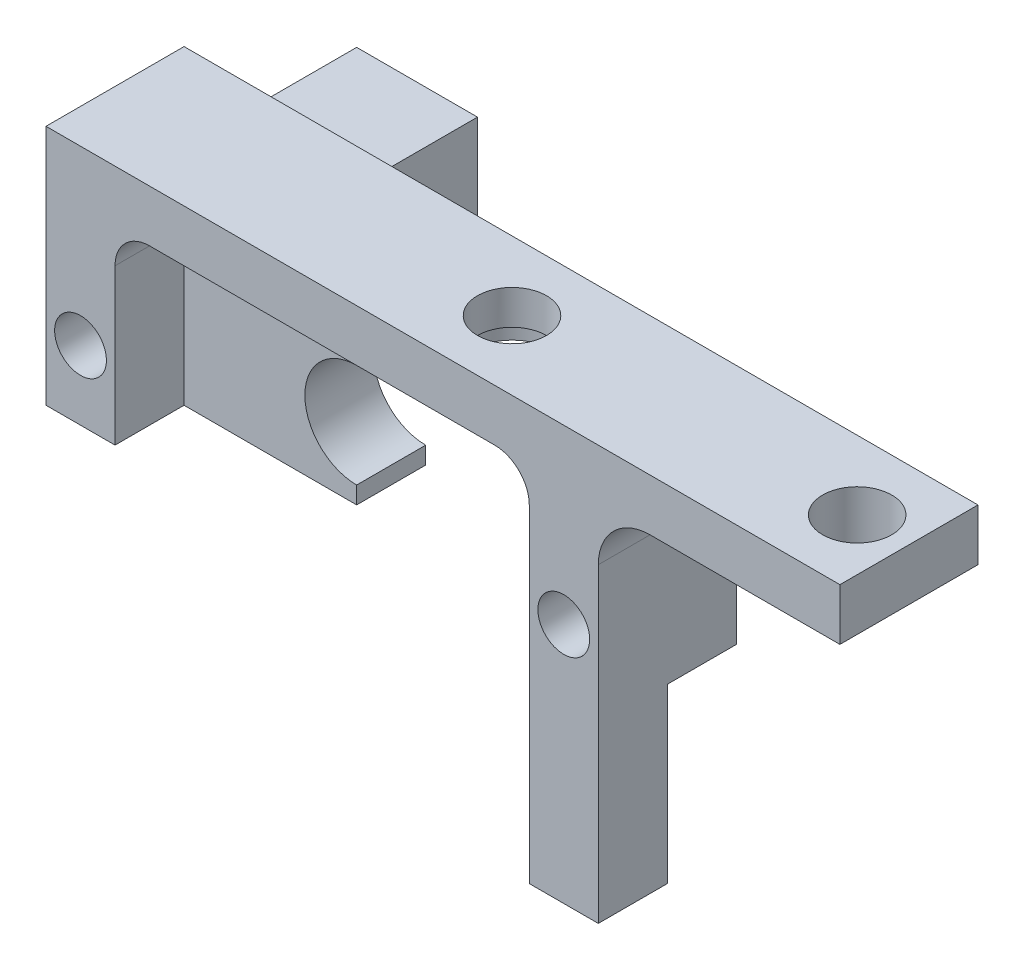
ISO-10303-21;
HEADER;
FILE_DESCRIPTION(('STEP AP214'),'2;1');
FILE_NAME('part.step','',(''),(''),'','','');
FILE_SCHEMA(('AUTOMOTIVE_DESIGN { 1 0 10303 214 1 1 1 1 }'));
ENDSEC;
DATA;
#1=APPLICATION_CONTEXT('core data for automotive mechanical design processes');
#2=APPLICATION_PROTOCOL_DEFINITION('international standard','automotive_design',2000,#1);
#3=PRODUCT_CONTEXT('',#1,'mechanical');
#4=PRODUCT('Part','Part','',(#3));
#5=PRODUCT_RELATED_PRODUCT_CATEGORY('part','',(#4));
#6=PRODUCT_DEFINITION_FORMATION('','',#4);
#7=PRODUCT_DEFINITION_CONTEXT('part definition',#1,'design');
#8=PRODUCT_DEFINITION('design','',#6,#7);
#9=PRODUCT_DEFINITION_SHAPE('','',#8);
#10=(LENGTH_UNIT() NAMED_UNIT(*) SI_UNIT(.MILLI.,.METRE.));
#11=(NAMED_UNIT(*) PLANE_ANGLE_UNIT() SI_UNIT($,.RADIAN.));
#12=(NAMED_UNIT(*) SI_UNIT($,.STERADIAN.) SOLID_ANGLE_UNIT());
#13=UNCERTAINTY_MEASURE_WITH_UNIT(LENGTH_MEASURE(1.E-05),#10,'distance_accuracy_value','');
#14=(GEOMETRIC_REPRESENTATION_CONTEXT(3) GLOBAL_UNCERTAINTY_ASSIGNED_CONTEXT((#13)) GLOBAL_UNIT_ASSIGNED_CONTEXT((#10,
#11,#12)) REPRESENTATION_CONTEXT('',''));
#15=CARTESIAN_POINT('',(0.,0.,0.));
#16=DIRECTION('',(0.,0.,1.));
#17=DIRECTION('',(1.,0.,0.));
#18=AXIS2_PLACEMENT_3D('',#15,#16,#17);
#19=CARTESIAN_POINT('',(7.,-3.,4.));
#20=DIRECTION('',(0.,1.,0.));
#21=DIRECTION('',(0.,0.,1.));
#22=AXIS2_PLACEMENT_3D('',#19,#20,#21);
#23=CYLINDRICAL_SURFACE('',#22,2.);
#24=CARTESIAN_POINT('',(7.,7.,4.));
#25=DIRECTION('',(0.,1.,0.));
#26=DIRECTION('',(0.,0.,1.));
#27=AXIS2_PLACEMENT_3D('',#24,#25,#26);
#28=CIRCLE('',#27,2.);
#29=CARTESIAN_POINT('',(7.,7.,6.));
#30=VERTEX_POINT('',#29);
#31=EDGE_CURVE('E268',#30,#30,#28,.T.);
#32=ORIENTED_EDGE('',*,*,#31,.T.);
#33=EDGE_LOOP('',(#32));
#34=FACE_BOUND('',#33,.T.);
#35=CARTESIAN_POINT('',(7.,5.,4.));
#36=DIRECTION('',(0.,-1.,0.));
#37=DIRECTION('',(0.,0.,-1.));
#38=AXIS2_PLACEMENT_3D('',#35,#36,#37);
#39=CIRCLE('',#38,2.);
#40=CARTESIAN_POINT('',(7.,5.,2.));
#41=VERTEX_POINT('',#40);
#42=EDGE_CURVE('E265',#41,#41,#39,.F.);
#43=ORIENTED_EDGE('',*,*,#42,.F.);
#44=EDGE_LOOP('',(#43));
#45=FACE_BOUND('',#44,.T.);
#46=ADVANCED_FACE('F39',(#34,#45),#23,.F.);
#47=CARTESIAN_POINT('',(0.,-7.,8.));
#48=DIRECTION('',(0.,1.,0.));
#49=DIRECTION('',(0.,0.,1.));
#50=AXIS2_PLACEMENT_3D('',#47,#48,#49);
#51=PLANE('',#50);
#52=DIRECTION('',(1.,0.,0.));
#53=VECTOR('',#52,1.);
#54=CARTESIAN_POINT('',(16.,-7.,4.));
#55=LINE('',#54,#53);
#56=CARTESIAN_POINT('',(12.,-7.,4.));
#57=VERTEX_POINT('',#56);
#58=CARTESIAN_POINT('',(16.,-7.,4.));
#59=VERTEX_POINT('',#58);
#60=EDGE_CURVE('E271',#57,#59,#55,.T.);
#61=ORIENTED_EDGE('',*,*,#60,.F.);
#62=DIRECTION('',(0.,0.,-1.));
#63=VECTOR('',#62,1.);
#64=CARTESIAN_POINT('',(12.,-7.,8.));
#65=LINE('',#64,#63);
#66=CARTESIAN_POINT('',(12.,-7.,0.));
#67=VERTEX_POINT('',#66);
#68=EDGE_CURVE('E342',#57,#67,#65,.T.);
#69=ORIENTED_EDGE('',*,*,#68,.T.);
#70=DIRECTION('',(1.,0.,0.));
#71=VECTOR('',#70,1.);
#72=CARTESIAN_POINT('',(0.,-7.,0.));
#73=LINE('',#72,#71);
#74=CARTESIAN_POINT('',(16.,-7.,0.));
#75=VERTEX_POINT('',#74);
#76=EDGE_CURVE('E411',#67,#75,#73,.T.);
#77=ORIENTED_EDGE('',*,*,#76,.T.);
#78=DIRECTION('',(0.,0.,-1.));
#79=VECTOR('',#78,1.);
#80=CARTESIAN_POINT('',(16.,-7.,8.));
#81=LINE('',#80,#79);
#82=EDGE_CURVE('E430',#59,#75,#81,.T.);
#83=ORIENTED_EDGE('',*,*,#82,.F.);
#84=EDGE_LOOP('',(#61,#69,#77,#83));
#85=FACE_BOUND('',#84,.T.);
#86=ADVANCED_FACE('F484',(#85),#51,.F.);
#87=DIRECTION('',(0.,0.,-1.));
#88=VECTOR('',#87,1.);
#89=CARTESIAN_POINT('',(-11.7533055844827,-7.,0.));
#90=LINE('',#89,#88);
#91=CARTESIAN_POINT('',(-11.7533055844827,-7.,0.));
#92=VERTEX_POINT('',#91);
#93=CARTESIAN_POINT('',(-11.7533055844827,-7.,-7.));
#94=VERTEX_POINT('',#93);
#95=EDGE_CURVE('E324',#92,#94,#90,.T.);
#96=ORIENTED_EDGE('',*,*,#95,.F.);
#97=CARTESIAN_POINT('',(-2.,-7.,0.));
#98=VERTEX_POINT('',#97);
#99=EDGE_CURVE('E415',#92,#98,#73,.T.);
#100=ORIENTED_EDGE('',*,*,#99,.T.);
#101=DIRECTION('',(0.,0.,-1.));
#102=VECTOR('',#101,1.);
#103=CARTESIAN_POINT('',(-2.,-7.,4.));
#104=LINE('',#103,#102);
#105=CARTESIAN_POINT('',(-2.,-7.,4.));
#106=VERTEX_POINT('',#105);
#107=EDGE_CURVE('E382',#106,#98,#104,.T.);
#108=ORIENTED_EDGE('',*,*,#107,.F.);
#109=DIRECTION('',(1.,0.,0.));
#110=VECTOR('',#109,1.);
#111=CARTESIAN_POINT('',(0.,-7.,4.));
#112=LINE('',#111,#110);
#113=CARTESIAN_POINT('',(-12.,-7.,4.));
#114=VERTEX_POINT('',#113);
#115=EDGE_CURVE('E353',#114,#106,#112,.T.);
#116=ORIENTED_EDGE('',*,*,#115,.F.);
#117=DIRECTION('',(0.,0.,-1.));
#118=VECTOR('',#117,1.);
#119=CARTESIAN_POINT('',(-12.,-7.,8.));
#120=LINE('',#119,#118);
#121=CARTESIAN_POINT('',(-12.,-7.,8.));
#122=VERTEX_POINT('',#121);
#123=EDGE_CURVE('E409',#122,#114,#120,.T.);
#124=ORIENTED_EDGE('',*,*,#123,.F.);
#125=DIRECTION('',(1.,0.,0.));
#126=VECTOR('',#125,1.);
#127=CARTESIAN_POINT('',(0.,-7.,8.));
#128=LINE('',#127,#126);
#129=CARTESIAN_POINT('',(-16.,-7.,8.));
#130=VERTEX_POINT('',#129);
#131=EDGE_CURVE('E391',#130,#122,#128,.T.);
#132=ORIENTED_EDGE('',*,*,#131,.F.);
#133=DIRECTION('',(0.,0.,-1.));
#134=VECTOR('',#133,1.);
#135=CARTESIAN_POINT('',(-16.,-7.,8.));
#136=LINE('',#135,#134);
#137=CARTESIAN_POINT('',(-16.,-7.,-10.));
#138=VERTEX_POINT('',#137);
#139=EDGE_CURVE('E425',#130,#138,#136,.T.);
#140=ORIENTED_EDGE('',*,*,#139,.T.);
#141=DIRECTION('',(-1.,0.,0.));
#142=VECTOR('',#141,1.);
#143=CARTESIAN_POINT('',(-16.,-7.,-10.));
#144=LINE('',#143,#142);
#145=CARTESIAN_POINT('',(-9.,-7.,-10.));
#146=VERTEX_POINT('',#145);
#147=EDGE_CURVE('E334',#146,#138,#144,.T.);
#148=ORIENTED_EDGE('',*,*,#147,.F.);
#149=DIRECTION('',(0.,0.,1.));
#150=VECTOR('',#149,1.);
#151=CARTESIAN_POINT('',(-9.,-7.,-10.));
#152=LINE('',#151,#150);
#153=CARTESIAN_POINT('',(-9.,-7.,-7.));
#154=VERTEX_POINT('',#153);
#155=EDGE_CURVE('E337',#146,#154,#152,.T.);
#156=ORIENTED_EDGE('',*,*,#155,.T.);
#157=DIRECTION('',(-1.,0.,0.));
#158=VECTOR('',#157,1.);
#159=CARTESIAN_POINT('',(0.,-7.,-7.));
#160=LINE('',#159,#158);
#161=EDGE_CURVE('E316',#154,#94,#160,.T.);
#162=ORIENTED_EDGE('',*,*,#161,.T.);
#163=EDGE_LOOP('',(#96,#100,#108,#116,#124,#132,#140,#148,#156,#162));
#164=FACE_BOUND('',#163,.T.);
#165=ADVANCED_FACE('F510',(#164),#51,.F.);
#166=CARTESIAN_POINT('',(-9.,7.,-10.));
#167=DIRECTION('',(-1.,0.,0.));
#168=DIRECTION('',(0.,-1.,0.));
#169=AXIS2_PLACEMENT_3D('',#166,#167,#168);
#170=PLANE('',#169);
#171=DIRECTION('',(0.,-1.,0.));
#172=VECTOR('',#171,1.);
#173=CARTESIAN_POINT('',(-9.,7.,-10.));
#174=LINE('',#173,#172);
#175=CARTESIAN_POINT('',(-9.,1.96034945359827,-10.));
#176=VERTEX_POINT('',#175);
#177=EDGE_CURVE('E332',#176,#146,#174,.T.);
#178=ORIENTED_EDGE('',*,*,#177,.F.);
#179=DIRECTION('',(0.,0.,-1.));
#180=VECTOR('',#179,1.);
#181=CARTESIAN_POINT('',(-9.,1.96034945359827,8.62543202569281));
#182=LINE('',#181,#180);
#183=CARTESIAN_POINT('',(-9.,1.96034945359827,0.));
#184=VERTEX_POINT('',#183);
#185=EDGE_CURVE('E297',#184,#176,#182,.T.);
#186=ORIENTED_EDGE('',*,*,#185,.F.);
#187=DIRECTION('',(0.,-1.,0.));
#188=VECTOR('',#187,1.);
#189=CARTESIAN_POINT('',(-9.,7.,0.));
#190=LINE('',#189,#188);
#191=CARTESIAN_POINT('',(-9.,-1.20437868815745,0.));
#192=VERTEX_POINT('',#191);
#193=EDGE_CURVE('E338',#184,#192,#190,.T.);
#194=ORIENTED_EDGE('',*,*,#193,.T.);
#195=DIRECTION('',(0.,0.,-1.));
#196=VECTOR('',#195,1.);
#197=CARTESIAN_POINT('',(-9.,-1.20437868815745,0.));
#198=LINE('',#197,#196);
#199=CARTESIAN_POINT('',(-9.,-1.20437868815745,-7.));
#200=VERTEX_POINT('',#199);
#201=EDGE_CURVE('E326',#192,#200,#198,.T.);
#202=ORIENTED_EDGE('',*,*,#201,.T.);
#203=DIRECTION('',(0.,-1.,0.));
#204=VECTOR('',#203,1.);
#205=CARTESIAN_POINT('',(-9.,7.,-7.));
#206=LINE('',#205,#204);
#207=EDGE_CURVE('E341',#200,#154,#206,.T.);
#208=ORIENTED_EDGE('',*,*,#207,.T.);
#209=ORIENTED_EDGE('',*,*,#155,.F.);
#210=EDGE_LOOP('',(#178,#186,#194,#202,#208,#209));
#211=FACE_BOUND('',#210,.T.);
#212=ADVANCED_FACE('F547',(#211),#170,.F.);
#213=CARTESIAN_POINT('',(0.,0.,0.));
#214=DIRECTION('',(0.,0.,1.));
#215=DIRECTION('',(1.,0.,0.));
#216=AXIS2_PLACEMENT_3D('',#213,#214,#215);
#217=PLANE('',#216);
#218=CARTESIAN_POINT('',(14.,-3.,0.));
#219=DIRECTION('',(0.,0.,1.));
#220=DIRECTION('',(1.,0.,0.));
#221=AXIS2_PLACEMENT_3D('',#218,#219,#220);
#222=CIRCLE('',#221,1.5);
#223=CARTESIAN_POINT('',(15.5,-3.,0.));
#224=VERTEX_POINT('',#223);
#225=EDGE_CURVE('E390',#224,#224,#222,.F.);
#226=ORIENTED_EDGE('',*,*,#225,.F.);
#227=EDGE_LOOP('',(#226));
#228=FACE_BOUND('',#227,.T.);
#229=DIRECTION('',(0.,1.,0.));
#230=VECTOR('',#229,1.);
#231=CARTESIAN_POINT('',(-12.,0.,0.));
#232=LINE('',#231,#230);
#233=CARTESIAN_POINT('',(-12.,2.,0.));
#234=VERTEX_POINT('',#233);
#235=CARTESIAN_POINT('',(-12.,4.96034945359827,0.));
#236=VERTEX_POINT('',#235);
#237=EDGE_CURVE('E434',#234,#236,#232,.T.);
#238=ORIENTED_EDGE('',*,*,#237,.T.);
#239=DIRECTION('',(-1.,0.,0.));
#240=VECTOR('',#239,1.);
#241=CARTESIAN_POINT('',(0.,4.96034945359827,0.));
#242=LINE('',#241,#240);
#243=CARTESIAN_POINT('',(-16.,4.96034945359827,0.));
#244=VERTEX_POINT('',#243);
#245=EDGE_CURVE('E437',#236,#244,#242,.T.);
#246=ORIENTED_EDGE('',*,*,#245,.T.);
#247=DIRECTION('',(0.,1.,0.));
#248=VECTOR('',#247,1.);
#249=CARTESIAN_POINT('',(-16.,7.,0.));
#250=LINE('',#249,#248);
#251=CARTESIAN_POINT('',(-16.,7.,0.));
#252=VERTEX_POINT('',#251);
#253=EDGE_CURVE('E295',#244,#252,#250,.T.);
#254=ORIENTED_EDGE('',*,*,#253,.T.);
#255=DIRECTION('',(1.,0.,0.));
#256=VECTOR('',#255,1.);
#257=CARTESIAN_POINT('',(0.,7.,0.));
#258=LINE('',#257,#256);
#259=CARTESIAN_POINT('',(30.,7.,0.));
#260=VERTEX_POINT('',#259);
#261=EDGE_CURVE('E418',#252,#260,#258,.T.);
#262=ORIENTED_EDGE('',*,*,#261,.T.);
#263=DIRECTION('',(0.,1.,0.));
#264=VECTOR('',#263,1.);
#265=CARTESIAN_POINT('',(30.,7.,0.));
#266=LINE('',#265,#264);
#267=CARTESIAN_POINT('',(30.,4.,0.));
#268=VERTEX_POINT('',#267);
#269=EDGE_CURVE('E248',#268,#260,#266,.T.);
#270=ORIENTED_EDGE('',*,*,#269,.F.);
#271=DIRECTION('',(-1.,0.,0.));
#272=VECTOR('',#271,1.);
#273=CARTESIAN_POINT('',(23.,4.,0.));
#274=LINE('',#273,#272);
#275=CARTESIAN_POINT('',(19.,4.,0.));
#276=VERTEX_POINT('',#275);
#277=EDGE_CURVE('E239',#268,#276,#274,.T.);
#278=ORIENTED_EDGE('',*,*,#277,.T.);
#279=CARTESIAN_POINT('',(19.,1.,0.));
#280=DIRECTION('',(0.,0.,1.));
#281=DIRECTION('',(1.,0.,0.));
#282=AXIS2_PLACEMENT_3D('',#279,#280,#281);
#283=CIRCLE('',#282,3.);
#284=CARTESIAN_POINT('',(16.,1.,0.));
#285=VERTEX_POINT('',#284);
#286=EDGE_CURVE('E451',#276,#285,#283,.T.);
#287=ORIENTED_EDGE('',*,*,#286,.T.);
#288=DIRECTION('',(0.,-1.,0.));
#289=VECTOR('',#288,1.);
#290=CARTESIAN_POINT('',(16.,0.,0.));
#291=LINE('',#290,#289);
#292=EDGE_CURVE('E414',#285,#75,#291,.T.);
#293=ORIENTED_EDGE('',*,*,#292,.T.);
#294=ORIENTED_EDGE('',*,*,#76,.F.);
#295=DIRECTION('',(0.,1.,0.));
#296=VECTOR('',#295,1.);
#297=CARTESIAN_POINT('',(12.,0.,0.));
#298=LINE('',#297,#296);
#299=CARTESIAN_POINT('',(12.,2.,0.));
#300=VERTEX_POINT('',#299);
#301=EDGE_CURVE('E376',#67,#300,#298,.T.);
#302=ORIENTED_EDGE('',*,*,#301,.T.);
#303=CARTESIAN_POINT('',(10.,2.,0.));
#304=DIRECTION('',(0.,0.,1.));
#305=DIRECTION('',(1.,0.,0.));
#306=AXIS2_PLACEMENT_3D('',#303,#304,#305);
#307=CIRCLE('',#306,2.);
#308=CARTESIAN_POINT('',(10.,4.,0.));
#309=VERTEX_POINT('',#308);
#310=EDGE_CURVE('E48',#300,#309,#307,.T.);
#311=ORIENTED_EDGE('',*,*,#310,.T.);
#312=DIRECTION('',(1.,0.,0.));
#313=VECTOR('',#312,1.);
#314=CARTESIAN_POINT('',(0.,4.,0.));
#315=LINE('',#314,#313);
#316=CARTESIAN_POINT('',(-10.,4.,0.));
#317=VERTEX_POINT('',#316);
#318=EDGE_CURVE('E420',#317,#309,#315,.T.);
#319=ORIENTED_EDGE('',*,*,#318,.F.);
#320=CARTESIAN_POINT('',(-10.,2.,0.));
#321=DIRECTION('',(0.,0.,1.));
#322=DIRECTION('',(1.,0.,0.));
#323=AXIS2_PLACEMENT_3D('',#320,#321,#322);
#324=CIRCLE('',#323,2.);
#325=EDGE_CURVE('E459',#317,#234,#324,.T.);
#326=ORIENTED_EDGE('',*,*,#325,.T.);
#327=EDGE_LOOP('',(#238,#246,#254,#262,#270,#278,#287,#293,#294,#302,#311,#319,#326));
#328=FACE_BOUND('',#327,.T.);
#329=ADVANCED_FACE('F479',(#228,#328),#217,.F.);
#330=ORIENTED_EDGE('',*,*,#99,.F.);
#331=CARTESIAN_POINT('',(5.54011802103854,-3.,0.));
#332=DIRECTION('',(0.,0.,-1.));
#333=DIRECTION('',(-1.,0.,0.));
#334=AXIS2_PLACEMENT_3D('',#331,#332,#333);
#335=CIRCLE('',#334,17.75);
#336=CARTESIAN_POINT('',(-12.2098819789615,-3.,0.));
#337=VERTEX_POINT('',#336);
#338=EDGE_CURVE('E307',#92,#337,#335,.T.);
#339=ORIENTED_EDGE('',*,*,#338,.T.);
#340=CARTESIAN_POINT('',(-10.4598819789615,-3.,0.));
#341=DIRECTION('',(0.,0.,-1.));
#342=DIRECTION('',(-1.,0.,0.));
#343=AXIS2_PLACEMENT_3D('',#340,#341,#342);
#344=CIRCLE('',#343,1.75);
#345=CARTESIAN_POINT('',(-10.4598819789615,-1.25,0.));
#346=VERTEX_POINT('',#345);
#347=EDGE_CURVE('E301',#337,#346,#344,.T.);
#348=ORIENTED_EDGE('',*,*,#347,.T.);
#349=DIRECTION('',(-0.999512076087079,-0.0312347523777212,0.));
#350=VECTOR('',#349,1.);
#351=CARTESIAN_POINT('',(0.0288196273375986,-0.922228074803155,0.));
#352=LINE('',#351,#350);
#353=EDGE_CURVE('E304',#192,#346,#352,.T.);
#354=ORIENTED_EDGE('',*,*,#353,.F.);
#355=ORIENTED_EDGE('',*,*,#193,.F.);
#356=DIRECTION('',(1.,0.,0.));
#357=VECTOR('',#356,1.);
#358=CARTESIAN_POINT('',(0.,1.96034945359827,0.));
#359=LINE('',#358,#357);
#360=CARTESIAN_POINT('',(-2.,1.96034945359827,0.));
#361=VERTEX_POINT('',#360);
#362=EDGE_CURVE('E369',#184,#361,#359,.T.);
#363=ORIENTED_EDGE('',*,*,#362,.T.);
#364=DIRECTION('',(0.,1.,0.));
#365=VECTOR('',#364,1.);
#366=CARTESIAN_POINT('',(-2.,0.,0.));
#367=LINE('',#366,#365);
#368=CARTESIAN_POINT('',(-2.,0.,0.));
#369=VERTEX_POINT('',#368);
#370=EDGE_CURVE('E350',#369,#361,#367,.T.);
#371=ORIENTED_EDGE('',*,*,#370,.F.);
#372=CARTESIAN_POINT('',(-2.,-3.,0.));
#373=DIRECTION('',(0.,0.,-1.));
#374=DIRECTION('',(-1.,0.,0.));
#375=AXIS2_PLACEMENT_3D('',#372,#373,#374);
#376=CIRCLE('',#375,3.);
#377=CARTESIAN_POINT('',(-2.,-6.,0.));
#378=VERTEX_POINT('',#377);
#379=EDGE_CURVE('E345',#378,#369,#376,.T.);
#380=ORIENTED_EDGE('',*,*,#379,.F.);
#381=DIRECTION('',(0.,-1.,0.));
#382=VECTOR('',#381,1.);
#383=CARTESIAN_POINT('',(-2.,0.,0.));
#384=LINE('',#383,#382);
#385=EDGE_CURVE('E366',#378,#98,#384,.T.);
#386=ORIENTED_EDGE('',*,*,#385,.T.);
#387=EDGE_LOOP('',(#330,#339,#348,#354,#355,#363,#371,#380,#386));
#388=FACE_BOUND('',#387,.T.);
#389=ADVANCED_FACE('F575',(#388),#217,.F.);
#390=CARTESIAN_POINT('',(12.,0.,8.));
#391=DIRECTION('',(-1.,0.,0.));
#392=DIRECTION('',(0.,0.,1.));
#393=AXIS2_PLACEMENT_3D('',#390,#391,#392);
#394=PLANE('',#393);
#395=DIRECTION('',(0.,1.,0.));
#396=VECTOR('',#395,1.);
#397=CARTESIAN_POINT('',(12.,0.,8.));
#398=LINE('',#397,#396);
#399=CARTESIAN_POINT('',(12.,-17.,8.));
#400=VERTEX_POINT('',#399);
#401=CARTESIAN_POINT('',(12.,2.,8.));
#402=VERTEX_POINT('',#401);
#403=EDGE_CURVE('E386',#400,#402,#398,.T.);
#404=ORIENTED_EDGE('',*,*,#403,.T.);
#405=DIRECTION('',(0.,0.,-1.));
#406=VECTOR('',#405,1.);
#407=CARTESIAN_POINT('',(12.,2.,8.));
#408=LINE('',#407,#406);
#409=EDGE_CURVE('E464',#402,#300,#408,.T.);
#410=ORIENTED_EDGE('',*,*,#409,.T.);
#411=ORIENTED_EDGE('',*,*,#301,.F.);
#412=ORIENTED_EDGE('',*,*,#68,.F.);
#413=DIRECTION('',(0.,1.,0.));
#414=VECTOR('',#413,1.);
#415=CARTESIAN_POINT('',(12.,-17.,4.));
#416=LINE('',#415,#414);
#417=CARTESIAN_POINT('',(12.,-17.,4.));
#418=VERTEX_POINT('',#417);
#419=EDGE_CURVE('E286',#418,#57,#416,.T.);
#420=ORIENTED_EDGE('',*,*,#419,.F.);
#421=DIRECTION('',(0.,0.,-1.));
#422=VECTOR('',#421,1.);
#423=CARTESIAN_POINT('',(12.,-17.,4.));
#424=LINE('',#423,#422);
#425=EDGE_CURVE('E278',#400,#418,#424,.T.);
#426=ORIENTED_EDGE('',*,*,#425,.F.);
#427=EDGE_LOOP('',(#404,#410,#411,#412,#420,#426));
#428=FACE_BOUND('',#427,.T.);
#429=ADVANCED_FACE('F473',(#428),#394,.T.);
#430=CARTESIAN_POINT('',(16.,0.,8.));
#431=DIRECTION('',(1.,0.,0.));
#432=DIRECTION('',(0.,0.,-1.));
#433=AXIS2_PLACEMENT_3D('',#430,#431,#432);
#434=PLANE('',#433);
#435=ORIENTED_EDGE('',*,*,#292,.F.);
#436=DIRECTION('',(0.,0.,-1.));
#437=VECTOR('',#436,1.);
#438=CARTESIAN_POINT('',(16.,1.,8.));
#439=LINE('',#438,#437);
#440=CARTESIAN_POINT('',(16.,1.,8.));
#441=VERTEX_POINT('',#440);
#442=EDGE_CURVE('E445',#285,#441,#439,.F.);
#443=ORIENTED_EDGE('',*,*,#442,.T.);
#444=DIRECTION('',(0.,-1.,0.));
#445=VECTOR('',#444,1.);
#446=CARTESIAN_POINT('',(16.,0.,8.));
#447=LINE('',#446,#445);
#448=CARTESIAN_POINT('',(16.,-17.,8.));
#449=VERTEX_POINT('',#448);
#450=EDGE_CURVE('E389',#441,#449,#447,.T.);
#451=ORIENTED_EDGE('',*,*,#450,.T.);
#452=DIRECTION('',(0.,0.,1.));
#453=VECTOR('',#452,1.);
#454=CARTESIAN_POINT('',(16.,-17.,4.));
#455=LINE('',#454,#453);
#456=CARTESIAN_POINT('',(16.,-17.,4.));
#457=VERTEX_POINT('',#456);
#458=EDGE_CURVE('E272',#457,#449,#455,.T.);
#459=ORIENTED_EDGE('',*,*,#458,.F.);
#460=DIRECTION('',(0.,1.,0.));
#461=VECTOR('',#460,1.);
#462=CARTESIAN_POINT('',(16.,-17.,4.));
#463=LINE('',#462,#461);
#464=EDGE_CURVE('E282',#457,#59,#463,.T.);
#465=ORIENTED_EDGE('',*,*,#464,.T.);
#466=ORIENTED_EDGE('',*,*,#82,.T.);
#467=EDGE_LOOP('',(#435,#443,#451,#459,#465,#466));
#468=FACE_BOUND('',#467,.T.);
#469=ADVANCED_FACE('F601',(#468),#434,.T.);
#470=CARTESIAN_POINT('',(0.,7.,8.));
#471=DIRECTION('',(0.,1.,0.));
#472=DIRECTION('',(0.,0.,1.));
#473=AXIS2_PLACEMENT_3D('',#470,#471,#472);
#474=PLANE('',#473);
#475=CARTESIAN_POINT('',(27.,7.,4.));
#476=DIRECTION('',(0.,1.,0.));
#477=DIRECTION('',(0.,0.,1.));
#478=AXIS2_PLACEMENT_3D('',#475,#476,#477);
#479=CIRCLE('',#478,2.);
#480=CARTESIAN_POINT('',(27.,7.,6.));
#481=VERTEX_POINT('',#480);
#482=EDGE_CURVE('E256',#481,#481,#479,.T.);
#483=ORIENTED_EDGE('',*,*,#482,.F.);
#484=EDGE_LOOP('',(#483));
#485=FACE_BOUND('',#484,.T.);
#486=ORIENTED_EDGE('',*,*,#31,.F.);
#487=EDGE_LOOP('',(#486));
#488=FACE_BOUND('',#487,.T.);
#489=ORIENTED_EDGE('',*,*,#261,.F.);
#490=DIRECTION('',(0.,0.,-1.));
#491=VECTOR('',#490,1.);
#492=CARTESIAN_POINT('',(-16.,7.,8.));
#493=LINE('',#492,#491);
#494=CARTESIAN_POINT('',(-16.,7.,8.));
#495=VERTEX_POINT('',#494);
#496=EDGE_CURVE('E427',#495,#252,#493,.T.);
#497=ORIENTED_EDGE('',*,*,#496,.F.);
#498=DIRECTION('',(1.,0.,0.));
#499=VECTOR('',#498,1.);
#500=CARTESIAN_POINT('',(0.,7.,8.));
#501=LINE('',#500,#499);
#502=CARTESIAN_POINT('',(30.,7.,8.));
#503=VERTEX_POINT('',#502);
#504=EDGE_CURVE('E396',#495,#503,#501,.T.);
#505=ORIENTED_EDGE('',*,*,#504,.T.);
#506=DIRECTION('',(0.,0.,1.));
#507=VECTOR('',#506,1.);
#508=CARTESIAN_POINT('',(30.,7.,8.));
#509=LINE('',#508,#507);
#510=EDGE_CURVE('E253',#260,#503,#509,.T.);
#511=ORIENTED_EDGE('',*,*,#510,.F.);
#512=EDGE_LOOP('',(#489,#497,#505,#511));
#513=FACE_BOUND('',#512,.T.);
#514=ADVANCED_FACE('F597',(#485,#488,#513),#474,.T.);
#515=CARTESIAN_POINT('',(-16.,0.,8.));
#516=DIRECTION('',(1.,0.,0.));
#517=DIRECTION('',(0.,0.,-1.));
#518=AXIS2_PLACEMENT_3D('',#515,#516,#517);
#519=PLANE('',#518);
#520=ORIENTED_EDGE('',*,*,#496,.T.);
#521=ORIENTED_EDGE('',*,*,#253,.F.);
#522=CARTESIAN_POINT('',(-16.,4.96034945359827,-3.));
#523=DIRECTION('',(1.,0.,0.));
#524=DIRECTION('',(0.,0.,-1.));
#525=AXIS2_PLACEMENT_3D('',#522,#523,#524);
#526=CIRCLE('',#525,3.);
#527=CARTESIAN_POINT('',(-16.,1.96034945359827,-3.));
#528=VERTEX_POINT('',#527);
#529=EDGE_CURVE('E447',#244,#528,#526,.T.);
#530=ORIENTED_EDGE('',*,*,#529,.T.);
#531=DIRECTION('',(0.,0.,-1.));
#532=VECTOR('',#531,1.);
#533=CARTESIAN_POINT('',(-16.,1.96034945359827,8.62543202569281));
#534=LINE('',#533,#532);
#535=CARTESIAN_POINT('',(-16.,1.96034945359827,-10.));
#536=VERTEX_POINT('',#535);
#537=EDGE_CURVE('E294',#528,#536,#534,.T.);
#538=ORIENTED_EDGE('',*,*,#537,.T.);
#539=DIRECTION('',(0.,1.,0.));
#540=VECTOR('',#539,1.);
#541=CARTESIAN_POINT('',(-16.,7.,-10.));
#542=LINE('',#541,#540);
#543=EDGE_CURVE('E323',#138,#536,#542,.T.);
#544=ORIENTED_EDGE('',*,*,#543,.F.);
#545=ORIENTED_EDGE('',*,*,#139,.F.);
#546=DIRECTION('',(0.,-1.,0.));
#547=VECTOR('',#546,1.);
#548=CARTESIAN_POINT('',(-16.,0.,8.));
#549=LINE('',#548,#547);
#550=EDGE_CURVE('E394',#495,#130,#549,.T.);
#551=ORIENTED_EDGE('',*,*,#550,.F.);
#552=EDGE_LOOP('',(#520,#521,#530,#538,#544,#545,#551));
#553=FACE_BOUND('',#552,.T.);
#554=ADVANCED_FACE('F590',(#553),#519,.F.);
#555=CARTESIAN_POINT('',(-12.,0.,8.));
#556=DIRECTION('',(-1.,0.,0.));
#557=DIRECTION('',(0.,-1.,0.));
#558=AXIS2_PLACEMENT_3D('',#555,#556,#557);
#559=PLANE('',#558);
#560=ORIENTED_EDGE('',*,*,#237,.F.);
#561=DIRECTION('',(0.,0.,-1.));
#562=VECTOR('',#561,1.);
#563=CARTESIAN_POINT('',(-12.,2.,8.));
#564=LINE('',#563,#562);
#565=CARTESIAN_POINT('',(-12.,2.,8.));
#566=VERTEX_POINT('',#565);
#567=EDGE_CURVE('E457',#234,#566,#564,.F.);
#568=ORIENTED_EDGE('',*,*,#567,.T.);
#569=DIRECTION('',(0.,1.,0.));
#570=VECTOR('',#569,1.);
#571=CARTESIAN_POINT('',(-12.,0.,8.));
#572=LINE('',#571,#570);
#573=EDGE_CURVE('E393',#122,#566,#572,.T.);
#574=ORIENTED_EDGE('',*,*,#573,.F.);
#575=ORIENTED_EDGE('',*,*,#123,.T.);
#576=DIRECTION('',(0.,-1.,0.));
#577=VECTOR('',#576,1.);
#578=CARTESIAN_POINT('',(-12.,0.,4.));
#579=LINE('',#578,#577);
#580=CARTESIAN_POINT('',(-12.,1.96034945359827,4.));
#581=VERTEX_POINT('',#580);
#582=EDGE_CURVE('E355',#581,#114,#579,.T.);
#583=ORIENTED_EDGE('',*,*,#582,.F.);
#584=DIRECTION('',(0.,0.,-1.));
#585=VECTOR('',#584,1.);
#586=CARTESIAN_POINT('',(-12.,1.96034945359827,4.));
#587=LINE('',#586,#585);
#588=CARTESIAN_POINT('',(-12.,1.96034945359827,-3.));
#589=VERTEX_POINT('',#588);
#590=EDGE_CURVE('E380',#581,#589,#587,.T.);
#591=ORIENTED_EDGE('',*,*,#590,.T.);
#592=CARTESIAN_POINT('',(-12.,4.96034945359827,-3.));
#593=DIRECTION('',(-1.,0.,0.));
#594=DIRECTION('',(0.,-1.,0.));
#595=AXIS2_PLACEMENT_3D('',#592,#593,#594);
#596=CIRCLE('',#595,3.);
#597=EDGE_CURVE('E449',#589,#236,#596,.T.);
#598=ORIENTED_EDGE('',*,*,#597,.T.);
#599=EDGE_LOOP('',(#560,#568,#574,#575,#583,#591,#598));
#600=FACE_BOUND('',#599,.T.);
#601=ADVANCED_FACE('F584',(#600),#559,.F.);
#602=CARTESIAN_POINT('',(-14.,-3.,8.));
#603=DIRECTION('',(0.,0.,-1.));
#604=DIRECTION('',(-1.,0.,0.));
#605=AXIS2_PLACEMENT_3D('',#602,#603,#604);
#606=CYLINDRICAL_SURFACE('',#605,1.5);
#607=CARTESIAN_POINT('',(-14.,-3.,8.));
#608=DIRECTION('',(0.,0.,1.));
#609=DIRECTION('',(1.,0.,0.));
#610=AXIS2_PLACEMENT_3D('',#607,#608,#609);
#611=CIRCLE('',#610,1.5);
#612=CARTESIAN_POINT('',(-12.5,-3.,8.));
#613=VERTEX_POINT('',#612);
#614=EDGE_CURVE('E403',#613,#613,#611,.T.);
#615=ORIENTED_EDGE('',*,*,#614,.T.);
#616=EDGE_LOOP('',(#615));
#617=FACE_BOUND('',#616,.T.);
#618=CARTESIAN_POINT('',(-14.,-3.,-10.));
#619=DIRECTION('',(0.,0.,1.));
#620=DIRECTION('',(1.,0.,0.));
#621=AXIS2_PLACEMENT_3D('',#618,#619,#620);
#622=CIRCLE('',#621,1.5);
#623=CARTESIAN_POINT('',(-12.5,-3.,-10.));
#624=VERTEX_POINT('',#623);
#625=EDGE_CURVE('E238',#624,#624,#622,.T.);
#626=ORIENTED_EDGE('',*,*,#625,.F.);
#627=EDGE_LOOP('',(#626));
#628=FACE_BOUND('',#627,.T.);
#629=ADVANCED_FACE('F581',(#617,#628),#606,.F.);
#630=CARTESIAN_POINT('',(0.,4.,8.));
#631=DIRECTION('',(0.,1.,0.));
#632=DIRECTION('',(0.,0.,1.));
#633=AXIS2_PLACEMENT_3D('',#630,#631,#632);
#634=PLANE('',#633);
#635=CARTESIAN_POINT('',(7.,4.,4.));
#636=DIRECTION('',(0.,-1.,0.));
#637=DIRECTION('',(0.,0.,-1.));
#638=AXIS2_PLACEMENT_3D('',#635,#636,#637);
#639=CIRCLE('',#638,2.5);
#640=CARTESIAN_POINT('',(7.,4.,1.5));
#641=VERTEX_POINT('',#640);
#642=EDGE_CURVE('E261',#641,#641,#639,.T.);
#643=ORIENTED_EDGE('',*,*,#642,.F.);
#644=EDGE_LOOP('',(#643));
#645=FACE_BOUND('',#644,.T.);
#646=ORIENTED_EDGE('',*,*,#318,.T.);
#647=DIRECTION('',(0.,0.,-1.));
#648=VECTOR('',#647,1.);
#649=CARTESIAN_POINT('',(10.,4.,8.));
#650=LINE('',#649,#648);
#651=CARTESIAN_POINT('',(10.,4.,8.));
#652=VERTEX_POINT('',#651);
#653=EDGE_CURVE('E61',#309,#652,#650,.F.);
#654=ORIENTED_EDGE('',*,*,#653,.T.);
#655=DIRECTION('',(1.,0.,0.));
#656=VECTOR('',#655,1.);
#657=CARTESIAN_POINT('',(0.,4.,8.));
#658=LINE('',#657,#656);
#659=CARTESIAN_POINT('',(-10.,4.,8.));
#660=VERTEX_POINT('',#659);
#661=EDGE_CURVE('E401',#660,#652,#658,.T.);
#662=ORIENTED_EDGE('',*,*,#661,.F.);
#663=DIRECTION('',(0.,0.,-1.));
#664=VECTOR('',#663,1.);
#665=CARTESIAN_POINT('',(-10.,4.,0.));
#666=LINE('',#665,#664);
#667=EDGE_CURVE('E454',#660,#317,#666,.T.);
#668=ORIENTED_EDGE('',*,*,#667,.T.);
#669=EDGE_LOOP('',(#646,#654,#662,#668));
#670=FACE_BOUND('',#669,.T.);
#671=ADVANCED_FACE('F579',(#645,#670),#634,.F.);
#672=CARTESIAN_POINT('',(14.,-3.,8.));
#673=DIRECTION('',(0.,0.,-1.));
#674=DIRECTION('',(-1.,0.,0.));
#675=AXIS2_PLACEMENT_3D('',#672,#673,#674);
#676=CYLINDRICAL_SURFACE('',#675,1.5);
#677=CARTESIAN_POINT('',(14.,-3.,8.));
#678=DIRECTION('',(0.,0.,1.));
#679=DIRECTION('',(1.,0.,0.));
#680=AXIS2_PLACEMENT_3D('',#677,#678,#679);
#681=CIRCLE('',#680,1.5);
#682=CARTESIAN_POINT('',(15.5,-3.,8.));
#683=VERTEX_POINT('',#682);
#684=EDGE_CURVE('E406',#683,#683,#681,.F.);
#685=ORIENTED_EDGE('',*,*,#684,.F.);
#686=EDGE_LOOP('',(#685));
#687=FACE_BOUND('',#686,.T.);
#688=ORIENTED_EDGE('',*,*,#225,.T.);
#689=EDGE_LOOP('',(#688));
#690=FACE_BOUND('',#689,.T.);
#691=ADVANCED_FACE('F572',(#687,#690),#676,.F.);
#692=CARTESIAN_POINT('',(0.,0.,8.));
#693=DIRECTION('',(0.,0.,1.));
#694=DIRECTION('',(1.,0.,0.));
#695=AXIS2_PLACEMENT_3D('',#692,#693,#694);
#696=PLANE('',#695);
#697=ORIENTED_EDGE('',*,*,#403,.F.);
#698=DIRECTION('',(-1.,0.,0.));
#699=VECTOR('',#698,1.);
#700=CARTESIAN_POINT('',(16.,-17.,8.));
#701=LINE('',#700,#699);
#702=EDGE_CURVE('E275',#449,#400,#701,.T.);
#703=ORIENTED_EDGE('',*,*,#702,.F.);
#704=ORIENTED_EDGE('',*,*,#450,.F.);
#705=CARTESIAN_POINT('',(19.,1.,8.));
#706=DIRECTION('',(0.,0.,1.));
#707=DIRECTION('',(1.,0.,0.));
#708=AXIS2_PLACEMENT_3D('',#705,#706,#707);
#709=CIRCLE('',#708,3.);
#710=CARTESIAN_POINT('',(19.,4.,8.));
#711=VERTEX_POINT('',#710);
#712=EDGE_CURVE('E234',#441,#711,#709,.F.);
#713=ORIENTED_EDGE('',*,*,#712,.T.);
#714=DIRECTION('',(-1.,0.,0.));
#715=VECTOR('',#714,1.);
#716=CARTESIAN_POINT('',(23.,4.,8.));
#717=LINE('',#716,#715);
#718=CARTESIAN_POINT('',(30.,4.,8.));
#719=VERTEX_POINT('',#718);
#720=EDGE_CURVE('E225',#719,#711,#717,.T.);
#721=ORIENTED_EDGE('',*,*,#720,.F.);
#722=DIRECTION('',(0.,-1.,0.));
#723=VECTOR('',#722,1.);
#724=CARTESIAN_POINT('',(30.,7.,8.));
#725=LINE('',#724,#723);
#726=EDGE_CURVE('E231',#503,#719,#725,.T.);
#727=ORIENTED_EDGE('',*,*,#726,.F.);
#728=ORIENTED_EDGE('',*,*,#504,.F.);
#729=ORIENTED_EDGE('',*,*,#550,.T.);
#730=ORIENTED_EDGE('',*,*,#131,.T.);
#731=ORIENTED_EDGE('',*,*,#573,.T.);
#732=CARTESIAN_POINT('',(-10.,2.,8.));
#733=DIRECTION('',(0.,0.,1.));
#734=DIRECTION('',(1.,0.,0.));
#735=AXIS2_PLACEMENT_3D('',#732,#733,#734);
#736=CIRCLE('',#735,2.);
#737=EDGE_CURVE('E462',#566,#660,#736,.F.);
#738=ORIENTED_EDGE('',*,*,#737,.T.);
#739=ORIENTED_EDGE('',*,*,#661,.T.);
#740=CARTESIAN_POINT('',(10.,2.,8.));
#741=DIRECTION('',(0.,0.,1.));
#742=DIRECTION('',(1.,0.,0.));
#743=AXIS2_PLACEMENT_3D('',#740,#741,#742);
#744=CIRCLE('',#743,2.);
#745=EDGE_CURVE('E11',#652,#402,#744,.F.);
#746=ORIENTED_EDGE('',*,*,#745,.T.);
#747=EDGE_LOOP('',(#697,#703,#704,#713,#721,#727,#728,#729,#730,#731,#738,#739,#746));
#748=FACE_BOUND('',#747,.T.);
#749=ORIENTED_EDGE('',*,*,#614,.F.);
#750=EDGE_LOOP('',(#749));
#751=FACE_BOUND('',#750,.T.);
#752=ORIENTED_EDGE('',*,*,#684,.T.);
#753=EDGE_LOOP('',(#752));
#754=FACE_BOUND('',#753,.T.);
#755=ADVANCED_FACE('F227',(#748,#751,#754),#696,.T.);
#756=CARTESIAN_POINT('',(-2.,-3.,4.));
#757=DIRECTION('',(0.,0.,-1.));
#758=DIRECTION('',(-1.,0.,0.));
#759=AXIS2_PLACEMENT_3D('',#756,#757,#758);
#760=CYLINDRICAL_SURFACE('',#759,3.);
#761=ORIENTED_EDGE('',*,*,#379,.T.);
#762=DIRECTION('',(0.,0.,-1.));
#763=VECTOR('',#762,1.);
#764=CARTESIAN_POINT('',(-2.,0.,4.));
#765=LINE('',#764,#763);
#766=CARTESIAN_POINT('',(-2.,0.,4.));
#767=VERTEX_POINT('',#766);
#768=EDGE_CURVE('E373',#767,#369,#765,.T.);
#769=ORIENTED_EDGE('',*,*,#768,.F.);
#770=CARTESIAN_POINT('',(-2.,-3.,4.));
#771=DIRECTION('',(0.,0.,-1.));
#772=DIRECTION('',(-1.,0.,0.));
#773=AXIS2_PLACEMENT_3D('',#770,#771,#772);
#774=CIRCLE('',#773,3.);
#775=CARTESIAN_POINT('',(-2.,-6.,4.));
#776=VERTEX_POINT('',#775);
#777=EDGE_CURVE('E346',#776,#767,#774,.T.);
#778=ORIENTED_EDGE('',*,*,#777,.F.);
#779=DIRECTION('',(0.,0.,-1.));
#780=VECTOR('',#779,1.);
#781=CARTESIAN_POINT('',(-2.,-6.,4.));
#782=LINE('',#781,#780);
#783=EDGE_CURVE('E363',#776,#378,#782,.T.);
#784=ORIENTED_EDGE('',*,*,#783,.T.);
#785=EDGE_LOOP('',(#761,#769,#778,#784));
#786=FACE_BOUND('',#785,.T.);
#787=ADVANCED_FACE('F559',(#786),#760,.F.);
#788=CARTESIAN_POINT('',(-2.,0.,4.));
#789=DIRECTION('',(-1.,0.,0.));
#790=DIRECTION('',(0.,-1.,0.));
#791=AXIS2_PLACEMENT_3D('',#788,#789,#790);
#792=PLANE('',#791);
#793=ORIENTED_EDGE('',*,*,#370,.T.);
#794=DIRECTION('',(0.,0.,-1.));
#795=VECTOR('',#794,1.);
#796=CARTESIAN_POINT('',(-2.,1.96034945359827,4.));
#797=LINE('',#796,#795);
#798=CARTESIAN_POINT('',(-2.,1.96034945359827,4.));
#799=VERTEX_POINT('',#798);
#800=EDGE_CURVE('E377',#799,#361,#797,.T.);
#801=ORIENTED_EDGE('',*,*,#800,.F.);
#802=DIRECTION('',(0.,1.,0.));
#803=VECTOR('',#802,1.);
#804=CARTESIAN_POINT('',(-2.,0.,4.));
#805=LINE('',#804,#803);
#806=EDGE_CURVE('E361',#767,#799,#805,.T.);
#807=ORIENTED_EDGE('',*,*,#806,.F.);
#808=ORIENTED_EDGE('',*,*,#768,.T.);
#809=EDGE_LOOP('',(#793,#801,#807,#808));
#810=FACE_BOUND('',#809,.T.);
#811=ADVANCED_FACE('F555',(#810),#792,.F.);
#812=CARTESIAN_POINT('',(0.,1.96034945359827,4.));
#813=DIRECTION('',(0.,1.,0.));
#814=DIRECTION('',(0.,0.,1.));
#815=AXIS2_PLACEMENT_3D('',#812,#813,#814);
#816=PLANE('',#815);
#817=ORIENTED_EDGE('',*,*,#537,.F.);
#818=DIRECTION('',(-1.,0.,0.));
#819=VECTOR('',#818,1.);
#820=CARTESIAN_POINT('',(0.,1.96034945359827,-3.));
#821=LINE('',#820,#819);
#822=EDGE_CURVE('E440',#528,#589,#821,.F.);
#823=ORIENTED_EDGE('',*,*,#822,.T.);
#824=ORIENTED_EDGE('',*,*,#590,.F.);
#825=DIRECTION('',(1.,0.,0.));
#826=VECTOR('',#825,1.);
#827=CARTESIAN_POINT('',(0.,1.96034945359827,4.));
#828=LINE('',#827,#826);
#829=EDGE_CURVE('E358',#581,#799,#828,.T.);
#830=ORIENTED_EDGE('',*,*,#829,.T.);
#831=ORIENTED_EDGE('',*,*,#800,.T.);
#832=ORIENTED_EDGE('',*,*,#362,.F.);
#833=ORIENTED_EDGE('',*,*,#185,.T.);
#834=DIRECTION('',(-1.,0.,0.));
#835=VECTOR('',#834,1.);
#836=CARTESIAN_POINT('',(-9.,1.96034945359827,-10.));
#837=LINE('',#836,#835);
#838=EDGE_CURVE('E291',#176,#536,#837,.T.);
#839=ORIENTED_EDGE('',*,*,#838,.T.);
#840=EDGE_LOOP('',(#817,#823,#824,#830,#831,#832,#833,#839));
#841=FACE_BOUND('',#840,.T.);
#842=ADVANCED_FACE('F558',(#841),#816,.T.);
#843=CARTESIAN_POINT('',(-2.,0.,4.));
#844=DIRECTION('',(1.,0.,0.));
#845=DIRECTION('',(0.,0.,-1.));
#846=AXIS2_PLACEMENT_3D('',#843,#844,#845);
#847=PLANE('',#846);
#848=ORIENTED_EDGE('',*,*,#385,.F.);
#849=ORIENTED_EDGE('',*,*,#783,.F.);
#850=DIRECTION('',(0.,-1.,0.));
#851=VECTOR('',#850,1.);
#852=CARTESIAN_POINT('',(-2.,0.,4.));
#853=LINE('',#852,#851);
#854=EDGE_CURVE('E349',#776,#106,#853,.T.);
#855=ORIENTED_EDGE('',*,*,#854,.T.);
#856=ORIENTED_EDGE('',*,*,#107,.T.);
#857=EDGE_LOOP('',(#848,#849,#855,#856));
#858=FACE_BOUND('',#857,.T.);
#859=ADVANCED_FACE('F553',(#858),#847,.T.);
#860=CARTESIAN_POINT('',(0.,0.,4.));
#861=DIRECTION('',(0.,0.,-1.));
#862=DIRECTION('',(-1.,0.,0.));
#863=AXIS2_PLACEMENT_3D('',#860,#861,#862);
#864=PLANE('',#863);
#865=ORIENTED_EDGE('',*,*,#777,.T.);
#866=ORIENTED_EDGE('',*,*,#806,.T.);
#867=ORIENTED_EDGE('',*,*,#829,.F.);
#868=ORIENTED_EDGE('',*,*,#582,.T.);
#869=ORIENTED_EDGE('',*,*,#115,.T.);
#870=ORIENTED_EDGE('',*,*,#854,.F.);
#871=EDGE_LOOP('',(#865,#866,#867,#868,#869,#870));
#872=FACE_BOUND('',#871,.T.);
#873=ADVANCED_FACE('F545',(#872),#864,.F.);
#874=CARTESIAN_POINT('',(0.,0.,-10.));
#875=DIRECTION('',(0.,0.,1.));
#876=DIRECTION('',(1.,0.,0.));
#877=AXIS2_PLACEMENT_3D('',#874,#875,#876);
#878=PLANE('',#877);
#879=ORIENTED_EDGE('',*,*,#625,.T.);
#880=EDGE_LOOP('',(#879));
#881=FACE_BOUND('',#880,.T.);
#882=ORIENTED_EDGE('',*,*,#543,.T.);
#883=ORIENTED_EDGE('',*,*,#838,.F.);
#884=ORIENTED_EDGE('',*,*,#177,.T.);
#885=ORIENTED_EDGE('',*,*,#147,.T.);
#886=EDGE_LOOP('',(#882,#883,#884,#885));
#887=FACE_BOUND('',#886,.T.);
#888=ADVANCED_FACE('F531',(#881,#887),#878,.F.);
#889=CARTESIAN_POINT('',(0.,0.,-7.));
#890=DIRECTION('',(0.,0.,-1.));
#891=DIRECTION('',(-1.,0.,0.));
#892=AXIS2_PLACEMENT_3D('',#889,#890,#891);
#893=PLANE('',#892);
#894=ORIENTED_EDGE('',*,*,#207,.F.);
#895=DIRECTION('',(-0.999512076087079,-0.0312347523777212,0.));
#896=VECTOR('',#895,1.);
#897=CARTESIAN_POINT('',(0.0288196273375986,-0.922228074803155,-7.));
#898=LINE('',#897,#896);
#899=CARTESIAN_POINT('',(-10.4598819789615,-1.25,-7.));
#900=VERTEX_POINT('',#899);
#901=EDGE_CURVE('E313',#200,#900,#898,.T.);
#902=ORIENTED_EDGE('',*,*,#901,.T.);
#903=CARTESIAN_POINT('',(-10.4598819789615,-3.,-7.));
#904=DIRECTION('',(0.,0.,-1.));
#905=DIRECTION('',(-1.,0.,0.));
#906=AXIS2_PLACEMENT_3D('',#903,#904,#905);
#907=CIRCLE('',#906,1.75);
#908=CARTESIAN_POINT('',(-12.2098819789615,-3.,-7.));
#909=VERTEX_POINT('',#908);
#910=EDGE_CURVE('E300',#909,#900,#907,.T.);
#911=ORIENTED_EDGE('',*,*,#910,.F.);
#912=CARTESIAN_POINT('',(5.54011802103854,-3.,-7.));
#913=DIRECTION('',(0.,0.,-1.));
#914=DIRECTION('',(-1.,0.,0.));
#915=AXIS2_PLACEMENT_3D('',#912,#913,#914);
#916=CIRCLE('',#915,17.75);
#917=EDGE_CURVE('E305',#94,#909,#916,.T.);
#918=ORIENTED_EDGE('',*,*,#917,.F.);
#919=ORIENTED_EDGE('',*,*,#161,.F.);
#920=EDGE_LOOP('',(#894,#902,#911,#918,#919));
#921=FACE_BOUND('',#920,.T.);
#922=ADVANCED_FACE('F527',(#921),#893,.F.);
#923=CARTESIAN_POINT('',(-10.4598819789615,-3.,0.));
#924=DIRECTION('',(0.,0.,-1.));
#925=DIRECTION('',(-1.,0.,0.));
#926=AXIS2_PLACEMENT_3D('',#923,#924,#925);
#927=CYLINDRICAL_SURFACE('',#926,1.75);
#928=ORIENTED_EDGE('',*,*,#910,.T.);
#929=DIRECTION('',(0.,0.,-1.));
#930=VECTOR('',#929,1.);
#931=CARTESIAN_POINT('',(-10.4598819789615,-1.25,0.));
#932=LINE('',#931,#930);
#933=EDGE_CURVE('E310',#346,#900,#932,.T.);
#934=ORIENTED_EDGE('',*,*,#933,.F.);
#935=ORIENTED_EDGE('',*,*,#347,.F.);
#936=DIRECTION('',(0.,0.,-1.));
#937=VECTOR('',#936,1.);
#938=CARTESIAN_POINT('',(-12.2098819789615,-3.,0.));
#939=LINE('',#938,#937);
#940=EDGE_CURVE('E321',#337,#909,#939,.T.);
#941=ORIENTED_EDGE('',*,*,#940,.T.);
#942=EDGE_LOOP('',(#928,#934,#935,#941));
#943=FACE_BOUND('',#942,.T.);
#944=ADVANCED_FACE('F530',(#943),#927,.F.);
#945=CARTESIAN_POINT('',(5.54011802103854,-3.,0.));
#946=DIRECTION('',(0.,0.,-1.));
#947=DIRECTION('',(-1.,0.,0.));
#948=AXIS2_PLACEMENT_3D('',#945,#946,#947);
#949=CYLINDRICAL_SURFACE('',#948,17.75);
#950=ORIENTED_EDGE('',*,*,#917,.T.);
#951=ORIENTED_EDGE('',*,*,#940,.F.);
#952=ORIENTED_EDGE('',*,*,#338,.F.);
#953=ORIENTED_EDGE('',*,*,#95,.T.);
#954=EDGE_LOOP('',(#950,#951,#952,#953));
#955=FACE_BOUND('',#954,.T.);
#956=ADVANCED_FACE('F533',(#955),#949,.F.);
#957=CARTESIAN_POINT('',(0.0288196273375986,-0.922228074803155,0.));
#958=DIRECTION('',(0.0312347523777212,-0.999512076087079,0.));
#959=DIRECTION('',(0.999512076087079,0.0312347523777212,0.));
#960=AXIS2_PLACEMENT_3D('',#957,#958,#959);
#961=PLANE('',#960);
#962=ORIENTED_EDGE('',*,*,#901,.F.);
#963=ORIENTED_EDGE('',*,*,#201,.F.);
#964=ORIENTED_EDGE('',*,*,#353,.T.);
#965=ORIENTED_EDGE('',*,*,#933,.T.);
#966=EDGE_LOOP('',(#962,#963,#964,#965));
#967=FACE_BOUND('',#966,.T.);
#968=ADVANCED_FACE('F525',(#967),#961,.T.);
#969=CARTESIAN_POINT('',(23.,4.,8.));
#970=DIRECTION('',(0.,1.,0.));
#971=DIRECTION('',(0.,0.,1.));
#972=AXIS2_PLACEMENT_3D('',#969,#970,#971);
#973=PLANE('',#972);
#974=CARTESIAN_POINT('',(27.,4.,4.));
#975=DIRECTION('',(0.,1.,0.));
#976=DIRECTION('',(0.,0.,1.));
#977=AXIS2_PLACEMENT_3D('',#974,#975,#976);
#978=CIRCLE('',#977,2.);
#979=CARTESIAN_POINT('',(27.,4.,6.));
#980=VERTEX_POINT('',#979);
#981=EDGE_CURVE('E43',#980,#980,#978,.T.);
#982=ORIENTED_EDGE('',*,*,#981,.T.);
#983=EDGE_LOOP('',(#982));
#984=FACE_BOUND('',#983,.T.);
#985=ORIENTED_EDGE('',*,*,#720,.T.);
#986=DIRECTION('',(0.,0.,-1.));
#987=VECTOR('',#986,1.);
#988=CARTESIAN_POINT('',(19.,4.,8.));
#989=LINE('',#988,#987);
#990=EDGE_CURVE('E443',#711,#276,#989,.T.);
#991=ORIENTED_EDGE('',*,*,#990,.T.);
#992=ORIENTED_EDGE('',*,*,#277,.F.);
#993=DIRECTION('',(0.,0.,-1.));
#994=VECTOR('',#993,1.);
#995=CARTESIAN_POINT('',(30.,4.,8.));
#996=LINE('',#995,#994);
#997=EDGE_CURVE('E242',#719,#268,#996,.T.);
#998=ORIENTED_EDGE('',*,*,#997,.F.);
#999=EDGE_LOOP('',(#985,#991,#992,#998));
#1000=FACE_BOUND('',#999,.T.);
#1001=ADVANCED_FACE('F243',(#984,#1000),#973,.F.);
#1002=CARTESIAN_POINT('',(0.,4.96034945359827,-3.));
#1003=DIRECTION('',(-1.,0.,0.));
#1004=DIRECTION('',(0.,0.,1.));
#1005=AXIS2_PLACEMENT_3D('',#1002,#1003,#1004);
#1006=CYLINDRICAL_SURFACE('',#1005,3.);
#1007=ORIENTED_EDGE('',*,*,#597,.F.);
#1008=ORIENTED_EDGE('',*,*,#822,.F.);
#1009=ORIENTED_EDGE('',*,*,#529,.F.);
#1010=ORIENTED_EDGE('',*,*,#245,.F.);
#1011=EDGE_LOOP('',(#1007,#1008,#1009,#1010));
#1012=FACE_BOUND('',#1011,.T.);
#1013=ADVANCED_FACE('F524',(#1012),#1006,.F.);
#1014=CARTESIAN_POINT('',(19.,1.,8.));
#1015=DIRECTION('',(0.,0.,-1.));
#1016=DIRECTION('',(-1.,0.,0.));
#1017=AXIS2_PLACEMENT_3D('',#1014,#1015,#1016);
#1018=CYLINDRICAL_SURFACE('',#1017,3.);
#1019=ORIENTED_EDGE('',*,*,#712,.F.);
#1020=ORIENTED_EDGE('',*,*,#442,.F.);
#1021=ORIENTED_EDGE('',*,*,#286,.F.);
#1022=ORIENTED_EDGE('',*,*,#990,.F.);
#1023=EDGE_LOOP('',(#1019,#1020,#1021,#1022));
#1024=FACE_BOUND('',#1023,.T.);
#1025=ADVANCED_FACE('F610',(#1024),#1018,.F.);
#1026=CARTESIAN_POINT('',(-10.,2.,8.));
#1027=DIRECTION('',(0.,0.,1.));
#1028=DIRECTION('',(1.,0.,0.));
#1029=AXIS2_PLACEMENT_3D('',#1026,#1027,#1028);
#1030=CYLINDRICAL_SURFACE('',#1029,2.);
#1031=ORIENTED_EDGE('',*,*,#737,.F.);
#1032=ORIENTED_EDGE('',*,*,#567,.F.);
#1033=ORIENTED_EDGE('',*,*,#325,.F.);
#1034=ORIENTED_EDGE('',*,*,#667,.F.);
#1035=EDGE_LOOP('',(#1031,#1032,#1033,#1034));
#1036=FACE_BOUND('',#1035,.T.);
#1037=ADVANCED_FACE('F521',(#1036),#1030,.F.);
#1038=CARTESIAN_POINT('',(16.,-17.,4.));
#1039=DIRECTION('',(0.,0.,1.));
#1040=DIRECTION('',(1.,0.,0.));
#1041=AXIS2_PLACEMENT_3D('',#1038,#1039,#1040);
#1042=PLANE('',#1041);
#1043=ORIENTED_EDGE('',*,*,#60,.T.);
#1044=ORIENTED_EDGE('',*,*,#464,.F.);
#1045=DIRECTION('',(1.,0.,0.));
#1046=VECTOR('',#1045,1.);
#1047=CARTESIAN_POINT('',(16.,-17.,4.));
#1048=LINE('',#1047,#1046);
#1049=EDGE_CURVE('E280',#418,#457,#1048,.T.);
#1050=ORIENTED_EDGE('',*,*,#1049,.F.);
#1051=ORIENTED_EDGE('',*,*,#419,.T.);
#1052=EDGE_LOOP('',(#1043,#1044,#1050,#1051));
#1053=FACE_BOUND('',#1052,.T.);
#1054=ADVANCED_FACE('F489',(#1053),#1042,.F.);
#1055=CARTESIAN_POINT('',(0.,-17.,0.));
#1056=DIRECTION('',(0.,-1.,0.));
#1057=DIRECTION('',(0.,0.,-1.));
#1058=AXIS2_PLACEMENT_3D('',#1055,#1056,#1057);
#1059=PLANE('',#1058);
#1060=ORIENTED_EDGE('',*,*,#458,.T.);
#1061=ORIENTED_EDGE('',*,*,#702,.T.);
#1062=ORIENTED_EDGE('',*,*,#425,.T.);
#1063=ORIENTED_EDGE('',*,*,#1049,.T.);
#1064=EDGE_LOOP('',(#1060,#1061,#1062,#1063));
#1065=FACE_BOUND('',#1064,.T.);
#1066=ADVANCED_FACE('F492',(#1065),#1059,.T.);
#1067=CARTESIAN_POINT('',(7.,5.,4.));
#1068=DIRECTION('',(0.,-1.,0.));
#1069=DIRECTION('',(0.,0.,-1.));
#1070=AXIS2_PLACEMENT_3D('',#1067,#1068,#1069);
#1071=PLANE('',#1070);
#1072=CARTESIAN_POINT('',(7.,5.,4.));
#1073=DIRECTION('',(0.,-1.,0.));
#1074=DIRECTION('',(0.,0.,-1.));
#1075=AXIS2_PLACEMENT_3D('',#1072,#1073,#1074);
#1076=CIRCLE('',#1075,2.5);
#1077=CARTESIAN_POINT('',(7.,5.,1.5));
#1078=VERTEX_POINT('',#1077);
#1079=EDGE_CURVE('E262',#1078,#1078,#1076,.T.);
#1080=ORIENTED_EDGE('',*,*,#1079,.T.);
#1081=EDGE_LOOP('',(#1080));
#1082=FACE_BOUND('',#1081,.T.);
#1083=ORIENTED_EDGE('',*,*,#42,.T.);
#1084=EDGE_LOOP('',(#1083));
#1085=FACE_BOUND('',#1084,.T.);
#1086=ADVANCED_FACE('F518',(#1082,#1085),#1071,.T.);
#1087=CARTESIAN_POINT('',(7.,5.,4.));
#1088=DIRECTION('',(0.,-1.,0.));
#1089=DIRECTION('',(0.,0.,-1.));
#1090=AXIS2_PLACEMENT_3D('',#1087,#1088,#1089);
#1091=CYLINDRICAL_SURFACE('',#1090,2.5);
#1092=ORIENTED_EDGE('',*,*,#1079,.F.);
#1093=EDGE_LOOP('',(#1092));
#1094=FACE_BOUND('',#1093,.T.);
#1095=ORIENTED_EDGE('',*,*,#642,.T.);
#1096=EDGE_LOOP('',(#1095));
#1097=FACE_BOUND('',#1096,.T.);
#1098=ADVANCED_FACE('F502',(#1094,#1097),#1091,.F.);
#1099=CARTESIAN_POINT('',(30.,0.,0.));
#1100=DIRECTION('',(1.,0.,0.));
#1101=DIRECTION('',(0.,0.,-1.));
#1102=AXIS2_PLACEMENT_3D('',#1099,#1100,#1101);
#1103=PLANE('',#1102);
#1104=ORIENTED_EDGE('',*,*,#726,.T.);
#1105=ORIENTED_EDGE('',*,*,#997,.T.);
#1106=ORIENTED_EDGE('',*,*,#269,.T.);
#1107=ORIENTED_EDGE('',*,*,#510,.T.);
#1108=EDGE_LOOP('',(#1104,#1105,#1106,#1107));
#1109=FACE_BOUND('',#1108,.T.);
#1110=ADVANCED_FACE('F251',(#1109),#1103,.T.);
#1111=CARTESIAN_POINT('',(10.,2.,8.));
#1112=DIRECTION('',(0.,0.,-1.));
#1113=DIRECTION('',(-1.,0.,0.));
#1114=AXIS2_PLACEMENT_3D('',#1111,#1112,#1113);
#1115=CYLINDRICAL_SURFACE('',#1114,2.);
#1116=ORIENTED_EDGE('',*,*,#745,.F.);
#1117=ORIENTED_EDGE('',*,*,#653,.F.);
#1118=ORIENTED_EDGE('',*,*,#310,.F.);
#1119=ORIENTED_EDGE('',*,*,#409,.F.);
#1120=EDGE_LOOP('',(#1116,#1117,#1118,#1119));
#1121=FACE_BOUND('',#1120,.T.);
#1122=ADVANCED_FACE('F41',(#1121),#1115,.F.);
#1123=CARTESIAN_POINT('',(27.,0.,4.));
#1124=DIRECTION('',(0.,1.,0.));
#1125=DIRECTION('',(0.,0.,1.));
#1126=AXIS2_PLACEMENT_3D('',#1123,#1124,#1125);
#1127=CYLINDRICAL_SURFACE('',#1126,2.);
#1128=ORIENTED_EDGE('',*,*,#482,.T.);
#1129=EDGE_LOOP('',(#1128));
#1130=FACE_BOUND('',#1129,.T.);
#1131=ORIENTED_EDGE('',*,*,#981,.F.);
#1132=EDGE_LOOP('',(#1131));
#1133=FACE_BOUND('',#1132,.T.);
#1134=ADVANCED_FACE('F495',(#1130,#1133),#1127,.F.);
#1135=CLOSED_SHELL('',(#46,#86,#165,#212,#329,#389,#429,#469,#514,#554,#601,#629,#671,#691,#755,
#787,#811,#842,#859,#873,#888,#922,#944,#956,#968,#1001,#1013,#1025,#1037,#1054,#1066,#1086,
#1098,#1110,#1122,#1134));
#1136=MANIFOLD_SOLID_BREP('B2',#1135);
#1137=ADVANCED_BREP_SHAPE_REPRESENTATION('',(#18,#1136),#14);
#1138=SHAPE_DEFINITION_REPRESENTATION(#9,#1137);
ENDSEC;
END-ISO-10303-21;
